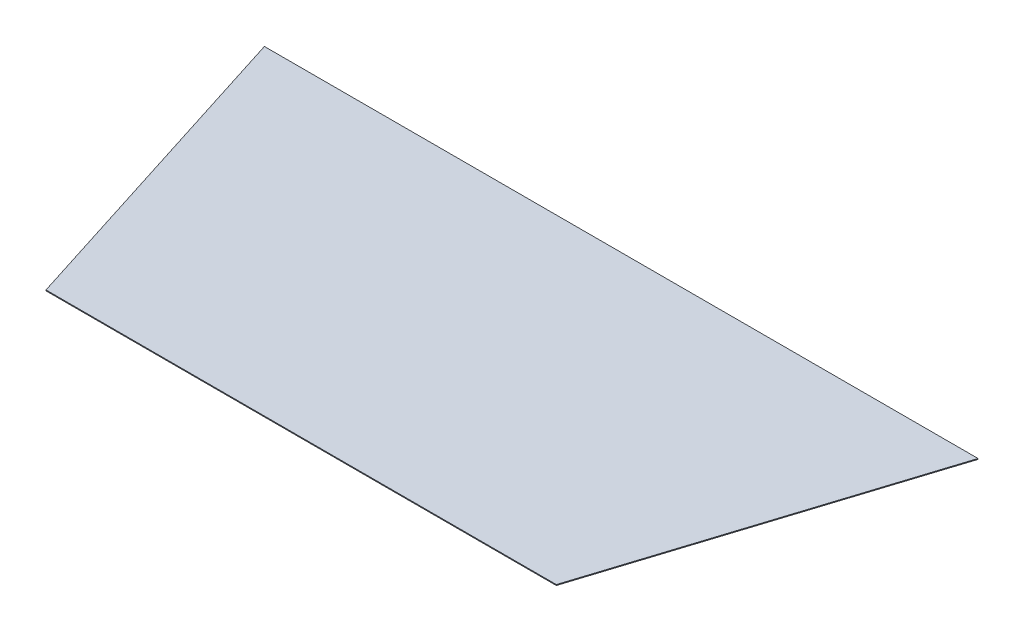
ISO-10303-21;
HEADER;
FILE_DESCRIPTION(('STEP AP214'),'2;1');
FILE_NAME('part.step','',(''),(''),'','','');
FILE_SCHEMA(('AUTOMOTIVE_DESIGN { 1 0 10303 214 1 1 1 1 }'));
ENDSEC;
DATA;
#1=APPLICATION_CONTEXT('core data for automotive mechanical design processes');
#2=APPLICATION_PROTOCOL_DEFINITION('international standard','automotive_design',2000,#1);
#3=PRODUCT_CONTEXT('',#1,'mechanical');
#4=PRODUCT('Part','Part','',(#3));
#5=PRODUCT_RELATED_PRODUCT_CATEGORY('part','',(#4));
#6=PRODUCT_DEFINITION_FORMATION('','',#4);
#7=PRODUCT_DEFINITION_CONTEXT('part definition',#1,'design');
#8=PRODUCT_DEFINITION('design','',#6,#7);
#9=PRODUCT_DEFINITION_SHAPE('','',#8);
#10=(LENGTH_UNIT() NAMED_UNIT(*) SI_UNIT(.MILLI.,.METRE.));
#11=(NAMED_UNIT(*) PLANE_ANGLE_UNIT() SI_UNIT($,.RADIAN.));
#12=(NAMED_UNIT(*) SI_UNIT($,.STERADIAN.) SOLID_ANGLE_UNIT());
#13=UNCERTAINTY_MEASURE_WITH_UNIT(LENGTH_MEASURE(1.E-05),#10,'distance_accuracy_value','');
#14=(GEOMETRIC_REPRESENTATION_CONTEXT(3) GLOBAL_UNCERTAINTY_ASSIGNED_CONTEXT((#13)) GLOBAL_UNIT_ASSIGNED_CONTEXT((#10,
#11,#12)) REPRESENTATION_CONTEXT('',''));
#15=CARTESIAN_POINT('',(0.,0.,0.));
#16=DIRECTION('',(0.,0.,1.));
#17=DIRECTION('',(1.,0.,0.));
#18=AXIS2_PLACEMENT_3D('',#15,#16,#17);
#19=CARTESIAN_POINT('',(330.,-0.8,-148.));
#20=DIRECTION('',(0.953094782970591,0.,0.302671991889309));
#21=DIRECTION('',(0.302671991889309,0.,-0.953094782970591));
#22=AXIS2_PLACEMENT_3D('',#19,#20,#21);
#23=PLANE('',#22);
#24=DIRECTION('',(0.302671991889309,0.,-0.953094782970591));
#25=VECTOR('',#24,1.);
#26=CARTESIAN_POINT('',(330.,0.,-148.));
#27=LINE('',#26,#25);
#28=CARTESIAN_POINT('',(236.,0.,148.));
#29=VERTEX_POINT('',#28);
#30=CARTESIAN_POINT('',(330.,0.,-148.));
#31=VERTEX_POINT('',#30);
#32=EDGE_CURVE('E97',#29,#31,#27,.T.);
#33=ORIENTED_EDGE('',*,*,#32,.F.);
#34=DIRECTION('',(0.,1.,0.));
#35=VECTOR('',#34,1.);
#36=CARTESIAN_POINT('',(236.,-0.8,148.));
#37=LINE('',#36,#35);
#38=CARTESIAN_POINT('',(236.,-0.8,148.));
#39=VERTEX_POINT('',#38);
#40=EDGE_CURVE('E11',#39,#29,#37,.T.);
#41=ORIENTED_EDGE('',*,*,#40,.F.);
#42=DIRECTION('',(0.302671991889309,0.,-0.953094782970591));
#43=VECTOR('',#42,1.);
#44=CARTESIAN_POINT('',(330.,-0.8,-148.));
#45=LINE('',#44,#43);
#46=CARTESIAN_POINT('',(330.,-0.8,-148.));
#47=VERTEX_POINT('',#46);
#48=EDGE_CURVE('E91',#39,#47,#45,.T.);
#49=ORIENTED_EDGE('',*,*,#48,.T.);
#50=DIRECTION('',(0.,1.,0.));
#51=VECTOR('',#50,1.);
#52=CARTESIAN_POINT('',(330.,-0.8,-148.));
#53=LINE('',#52,#51);
#54=EDGE_CURVE('E36',#47,#31,#53,.T.);
#55=ORIENTED_EDGE('',*,*,#54,.T.);
#56=EDGE_LOOP('',(#33,#41,#49,#55));
#57=FACE_BOUND('',#56,.T.);
#58=ADVANCED_FACE('F33',(#57),#23,.T.);
#59=CARTESIAN_POINT('',(-236.,-0.8,148.));
#60=DIRECTION('',(0.,0.,1.));
#61=DIRECTION('',(1.,0.,0.));
#62=AXIS2_PLACEMENT_3D('',#59,#60,#61);
#63=PLANE('',#62);
#64=DIRECTION('',(1.,0.,0.));
#65=VECTOR('',#64,1.);
#66=CARTESIAN_POINT('',(-236.,0.,148.));
#67=LINE('',#66,#65);
#68=CARTESIAN_POINT('',(-236.,0.,148.));
#69=VERTEX_POINT('',#68);
#70=EDGE_CURVE('E93',#69,#29,#67,.T.);
#71=ORIENTED_EDGE('',*,*,#70,.F.);
#72=DIRECTION('',(0.,1.,0.));
#73=VECTOR('',#72,1.);
#74=CARTESIAN_POINT('',(-236.,-0.8,148.));
#75=LINE('',#74,#73);
#76=CARTESIAN_POINT('',(-236.,-0.8,148.));
#77=VERTEX_POINT('',#76);
#78=EDGE_CURVE('E42',#77,#69,#75,.T.);
#79=ORIENTED_EDGE('',*,*,#78,.F.);
#80=DIRECTION('',(1.,0.,0.));
#81=VECTOR('',#80,1.);
#82=CARTESIAN_POINT('',(-236.,-0.8,148.));
#83=LINE('',#82,#81);
#84=EDGE_CURVE('E88',#77,#39,#83,.T.);
#85=ORIENTED_EDGE('',*,*,#84,.T.);
#86=ORIENTED_EDGE('',*,*,#40,.T.);
#87=EDGE_LOOP('',(#71,#79,#85,#86));
#88=FACE_BOUND('',#87,.T.);
#89=ADVANCED_FACE('F107',(#88),#63,.T.);
#90=CARTESIAN_POINT('',(-330.,-0.8,-148.));
#91=DIRECTION('',(-0.953094782970591,0.,0.302671991889309));
#92=DIRECTION('',(0.302671991889309,0.,0.953094782970591));
#93=AXIS2_PLACEMENT_3D('',#90,#91,#92);
#94=PLANE('',#93);
#95=DIRECTION('',(0.302671991889309,0.,0.953094782970591));
#96=VECTOR('',#95,1.);
#97=CARTESIAN_POINT('',(-330.,0.,-148.));
#98=LINE('',#97,#96);
#99=CARTESIAN_POINT('',(-330.,0.,-148.));
#100=VERTEX_POINT('',#99);
#101=EDGE_CURVE('E83',#100,#69,#98,.T.);
#102=ORIENTED_EDGE('',*,*,#101,.F.);
#103=DIRECTION('',(0.,1.,0.));
#104=VECTOR('',#103,1.);
#105=CARTESIAN_POINT('',(-330.,-0.8,-148.));
#106=LINE('',#105,#104);
#107=CARTESIAN_POINT('',(-330.,-0.8,-148.));
#108=VERTEX_POINT('',#107);
#109=EDGE_CURVE('E78',#108,#100,#106,.T.);
#110=ORIENTED_EDGE('',*,*,#109,.F.);
#111=DIRECTION('',(0.302671991889309,0.,0.953094782970591));
#112=VECTOR('',#111,1.);
#113=CARTESIAN_POINT('',(-330.,-0.8,-148.));
#114=LINE('',#113,#112);
#115=EDGE_CURVE('E81',#108,#77,#114,.T.);
#116=ORIENTED_EDGE('',*,*,#115,.T.);
#117=ORIENTED_EDGE('',*,*,#78,.T.);
#118=EDGE_LOOP('',(#102,#110,#116,#117));
#119=FACE_BOUND('',#118,.T.);
#120=ADVANCED_FACE('F80',(#119),#94,.T.);
#121=CARTESIAN_POINT('',(-330.,-0.8,-148.));
#122=DIRECTION('',(0.,0.,-1.));
#123=DIRECTION('',(-1.,0.,0.));
#124=AXIS2_PLACEMENT_3D('',#121,#122,#123);
#125=PLANE('',#124);
#126=DIRECTION('',(-1.,0.,0.));
#127=VECTOR('',#126,1.);
#128=CARTESIAN_POINT('',(-330.,0.,-148.));
#129=LINE('',#128,#127);
#130=EDGE_CURVE('E100',#31,#100,#129,.T.);
#131=ORIENTED_EDGE('',*,*,#130,.F.);
#132=ORIENTED_EDGE('',*,*,#54,.F.);
#133=DIRECTION('',(-1.,0.,0.));
#134=VECTOR('',#133,1.);
#135=CARTESIAN_POINT('',(-330.,-0.8,-148.));
#136=LINE('',#135,#134);
#137=EDGE_CURVE('E87',#47,#108,#136,.T.);
#138=ORIENTED_EDGE('',*,*,#137,.T.);
#139=ORIENTED_EDGE('',*,*,#109,.T.);
#140=EDGE_LOOP('',(#131,#132,#138,#139));
#141=FACE_BOUND('',#140,.T.);
#142=ADVANCED_FACE('F90',(#141),#125,.T.);
#143=CARTESIAN_POINT('',(236.,-0.8,148.));
#144=DIRECTION('',(0.,1.,0.));
#145=DIRECTION('',(0.,0.,1.));
#146=AXIS2_PLACEMENT_3D('',#143,#144,#145);
#147=PLANE('',#146);
#148=ORIENTED_EDGE('',*,*,#48,.F.);
#149=ORIENTED_EDGE('',*,*,#84,.F.);
#150=ORIENTED_EDGE('',*,*,#115,.F.);
#151=ORIENTED_EDGE('',*,*,#137,.F.);
#152=EDGE_LOOP('',(#148,#149,#150,#151));
#153=FACE_BOUND('',#152,.T.);
#154=ADVANCED_FACE('F86',(#153),#147,.F.);
#155=CARTESIAN_POINT('',(236.,0.,148.));
#156=DIRECTION('',(0.,1.,0.));
#157=DIRECTION('',(0.,0.,1.));
#158=AXIS2_PLACEMENT_3D('',#155,#156,#157);
#159=PLANE('',#158);
#160=ORIENTED_EDGE('',*,*,#32,.T.);
#161=ORIENTED_EDGE('',*,*,#130,.T.);
#162=ORIENTED_EDGE('',*,*,#101,.T.);
#163=ORIENTED_EDGE('',*,*,#70,.T.);
#164=EDGE_LOOP('',(#160,#161,#162,#163));
#165=FACE_BOUND('',#164,.T.);
#166=ADVANCED_FACE('F106',(#165),#159,.T.);
#167=CLOSED_SHELL('',(#58,#89,#120,#142,#154,#166));
#168=MANIFOLD_SOLID_BREP('B2',#167);
#169=ADVANCED_BREP_SHAPE_REPRESENTATION('',(#18,#168),#14);
#170=SHAPE_DEFINITION_REPRESENTATION(#9,#169);
ENDSEC;
END-ISO-10303-21;
